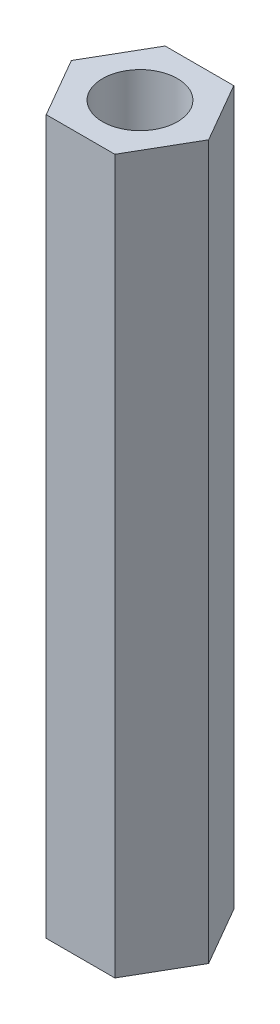
ISO-10303-21;
HEADER;
FILE_DESCRIPTION(('STEP AP214'),'2;1');
FILE_NAME('part.step','',(''),(''),'','','');
FILE_SCHEMA(('AUTOMOTIVE_DESIGN { 1 0 10303 214 1 1 1 1 }'));
ENDSEC;
DATA;
#1=APPLICATION_CONTEXT('core data for automotive mechanical design processes');
#2=APPLICATION_PROTOCOL_DEFINITION('international standard','automotive_design',2000,#1);
#3=PRODUCT_CONTEXT('',#1,'mechanical');
#4=PRODUCT('Part','Part','',(#3));
#5=PRODUCT_RELATED_PRODUCT_CATEGORY('part','',(#4));
#6=PRODUCT_DEFINITION_FORMATION('','',#4);
#7=PRODUCT_DEFINITION_CONTEXT('part definition',#1,'design');
#8=PRODUCT_DEFINITION('design','',#6,#7);
#9=PRODUCT_DEFINITION_SHAPE('','',#8);
#10=(LENGTH_UNIT() NAMED_UNIT(*) SI_UNIT(.MILLI.,.METRE.));
#11=(NAMED_UNIT(*) PLANE_ANGLE_UNIT() SI_UNIT($,.RADIAN.));
#12=(NAMED_UNIT(*) SI_UNIT($,.STERADIAN.) SOLID_ANGLE_UNIT());
#13=UNCERTAINTY_MEASURE_WITH_UNIT(LENGTH_MEASURE(1.E-05),#10,'distance_accuracy_value','');
#14=(GEOMETRIC_REPRESENTATION_CONTEXT(3) GLOBAL_UNCERTAINTY_ASSIGNED_CONTEXT((#13)) GLOBAL_UNIT_ASSIGNED_CONTEXT((#10,
#11,#12)) REPRESENTATION_CONTEXT('',''));
#15=CARTESIAN_POINT('',(0.,0.,0.));
#16=DIRECTION('',(0.,0.,1.));
#17=DIRECTION('',(1.,0.,0.));
#18=AXIS2_PLACEMENT_3D('',#15,#16,#17);
#19=CARTESIAN_POINT('',(1.44337567297409,30.,2.49999999999998));
#20=DIRECTION('',(-0.866025403784442,0.,-0.499999999999995));
#21=DIRECTION('',(-0.499999999999995,0.,0.866025403784442));
#22=AXIS2_PLACEMENT_3D('',#19,#20,#21);
#23=PLANE('',#22);
#24=DIRECTION('',(0.499999999999995,0.,-0.866025403784442));
#25=VECTOR('',#24,1.);
#26=CARTESIAN_POINT('',(1.44337567297409,0.,2.49999999999998));
#27=LINE('',#26,#25);
#28=CARTESIAN_POINT('',(1.44337567297409,0.,2.49999999999998));
#29=VERTEX_POINT('',#28);
#30=CARTESIAN_POINT('',(2.88675134594812,0.,0.));
#31=VERTEX_POINT('',#30);
#32=EDGE_CURVE('E124',#29,#31,#27,.T.);
#33=ORIENTED_EDGE('',*,*,#32,.T.);
#34=DIRECTION('',(0.,-1.,0.));
#35=VECTOR('',#34,1.);
#36=CARTESIAN_POINT('',(2.88675134594812,30.,0.));
#37=LINE('',#36,#35);
#38=CARTESIAN_POINT('',(2.88675134594812,30.,0.));
#39=VERTEX_POINT('',#38);
#40=EDGE_CURVE('E11',#39,#31,#37,.T.);
#41=ORIENTED_EDGE('',*,*,#40,.F.);
#42=DIRECTION('',(0.499999999999995,0.,-0.866025403784442));
#43=VECTOR('',#42,1.);
#44=CARTESIAN_POINT('',(1.44337567297409,30.,2.49999999999998));
#45=LINE('',#44,#43);
#46=CARTESIAN_POINT('',(1.44337567297409,30.,2.49999999999998));
#47=VERTEX_POINT('',#46);
#48=EDGE_CURVE('E135',#47,#39,#45,.T.);
#49=ORIENTED_EDGE('',*,*,#48,.F.);
#50=DIRECTION('',(0.,-1.,0.));
#51=VECTOR('',#50,1.);
#52=CARTESIAN_POINT('',(1.44337567297409,30.,2.49999999999998));
#53=LINE('',#52,#51);
#54=EDGE_CURVE('E120',#47,#29,#53,.T.);
#55=ORIENTED_EDGE('',*,*,#54,.T.);
#56=EDGE_LOOP('',(#33,#41,#49,#55));
#57=FACE_BOUND('',#56,.T.);
#58=ADVANCED_FACE('F37',(#57),#23,.F.);
#59=CARTESIAN_POINT('',(2.88675134594812,30.,0.));
#60=DIRECTION('',(-0.866025403784438,0.,0.500000000000001));
#61=DIRECTION('',(0.500000000000001,0.,0.866025403784438));
#62=AXIS2_PLACEMENT_3D('',#59,#60,#61);
#63=PLANE('',#62);
#64=DIRECTION('',(-0.500000000000001,0.,-0.866025403784438));
#65=VECTOR('',#64,1.);
#66=CARTESIAN_POINT('',(2.88675134594812,0.,0.));
#67=LINE('',#66,#65);
#68=CARTESIAN_POINT('',(1.44337567297405,0.,-2.5));
#69=VERTEX_POINT('',#68);
#70=EDGE_CURVE('E127',#31,#69,#67,.T.);
#71=ORIENTED_EDGE('',*,*,#70,.T.);
#72=DIRECTION('',(0.,-1.,0.));
#73=VECTOR('',#72,1.);
#74=CARTESIAN_POINT('',(1.44337567297405,30.,-2.5));
#75=LINE('',#74,#73);
#76=CARTESIAN_POINT('',(1.44337567297405,30.,-2.5));
#77=VERTEX_POINT('',#76);
#78=EDGE_CURVE('E45',#77,#69,#75,.T.);
#79=ORIENTED_EDGE('',*,*,#78,.F.);
#80=DIRECTION('',(-0.500000000000001,0.,-0.866025403784438));
#81=VECTOR('',#80,1.);
#82=CARTESIAN_POINT('',(2.88675134594812,30.,0.));
#83=LINE('',#82,#81);
#84=EDGE_CURVE('E91',#39,#77,#83,.T.);
#85=ORIENTED_EDGE('',*,*,#84,.F.);
#86=ORIENTED_EDGE('',*,*,#40,.T.);
#87=EDGE_LOOP('',(#71,#79,#85,#86));
#88=FACE_BOUND('',#87,.T.);
#89=ADVANCED_FACE('F160',(#88),#63,.F.);
#90=CARTESIAN_POINT('',(1.44337567297405,30.,-2.5));
#91=DIRECTION('',(0.,0.,1.));
#92=DIRECTION('',(1.,0.,0.));
#93=AXIS2_PLACEMENT_3D('',#90,#91,#92);
#94=PLANE('',#93);
#95=DIRECTION('',(-1.,0.,0.));
#96=VECTOR('',#95,1.);
#97=CARTESIAN_POINT('',(1.44337567297405,0.,-2.5));
#98=LINE('',#97,#96);
#99=CARTESIAN_POINT('',(-1.44337567297407,0.,-2.49999999999999));
#100=VERTEX_POINT('',#99);
#101=EDGE_CURVE('E130',#69,#100,#98,.T.);
#102=ORIENTED_EDGE('',*,*,#101,.T.);
#103=DIRECTION('',(0.,-1.,0.));
#104=VECTOR('',#103,1.);
#105=CARTESIAN_POINT('',(-1.44337567297407,30.,-2.49999999999999));
#106=LINE('',#105,#104);
#107=CARTESIAN_POINT('',(-1.44337567297407,30.,-2.49999999999999));
#108=VERTEX_POINT('',#107);
#109=EDGE_CURVE('E115',#108,#100,#106,.T.);
#110=ORIENTED_EDGE('',*,*,#109,.F.);
#111=DIRECTION('',(-1.,0.,0.));
#112=VECTOR('',#111,1.);
#113=CARTESIAN_POINT('',(1.44337567297405,30.,-2.5));
#114=LINE('',#113,#112);
#115=EDGE_CURVE('E106',#77,#108,#114,.T.);
#116=ORIENTED_EDGE('',*,*,#115,.F.);
#117=ORIENTED_EDGE('',*,*,#78,.T.);
#118=EDGE_LOOP('',(#102,#110,#116,#117));
#119=FACE_BOUND('',#118,.T.);
#120=ADVANCED_FACE('F141',(#119),#94,.F.);
#121=CARTESIAN_POINT('',(-1.44337567297407,30.,-2.49999999999999));
#122=DIRECTION('',(0.866025403784442,0.,0.499999999999995));
#123=DIRECTION('',(0.499999999999995,0.,-0.866025403784442));
#124=AXIS2_PLACEMENT_3D('',#121,#122,#123);
#125=PLANE('',#124);
#126=DIRECTION('',(-0.499999999999995,0.,0.866025403784442));
#127=VECTOR('',#126,1.);
#128=CARTESIAN_POINT('',(-1.44337567297407,0.,-2.49999999999999));
#129=LINE('',#128,#127);
#130=CARTESIAN_POINT('',(-2.88675134594812,0.,0.));
#131=VERTEX_POINT('',#130);
#132=EDGE_CURVE('E114',#100,#131,#129,.T.);
#133=ORIENTED_EDGE('',*,*,#132,.T.);
#134=DIRECTION('',(0.,-1.,0.));
#135=VECTOR('',#134,1.);
#136=CARTESIAN_POINT('',(-2.88675134594812,30.,0.));
#137=LINE('',#136,#135);
#138=CARTESIAN_POINT('',(-2.88675134594812,30.,0.));
#139=VERTEX_POINT('',#138);
#140=EDGE_CURVE('E111',#139,#131,#137,.T.);
#141=ORIENTED_EDGE('',*,*,#140,.F.);
#142=DIRECTION('',(-0.499999999999995,0.,0.866025403784442));
#143=VECTOR('',#142,1.);
#144=CARTESIAN_POINT('',(-1.44337567297407,30.,-2.49999999999999));
#145=LINE('',#144,#143);
#146=EDGE_CURVE('E100',#108,#139,#145,.T.);
#147=ORIENTED_EDGE('',*,*,#146,.F.);
#148=ORIENTED_EDGE('',*,*,#109,.T.);
#149=EDGE_LOOP('',(#133,#141,#147,#148));
#150=FACE_BOUND('',#149,.T.);
#151=ADVANCED_FACE('F112',(#150),#125,.F.);
#152=CARTESIAN_POINT('',(-2.88675134594812,30.,0.));
#153=DIRECTION('',(0.866025403784435,0.,-0.500000000000007));
#154=DIRECTION('',(-0.500000000000007,0.,-0.866025403784435));
#155=AXIS2_PLACEMENT_3D('',#152,#153,#154);
#156=PLANE('',#155);
#157=DIRECTION('',(0.500000000000007,0.,0.866025403784435));
#158=VECTOR('',#157,1.);
#159=CARTESIAN_POINT('',(-2.88675134594812,0.,0.));
#160=LINE('',#159,#158);
#161=CARTESIAN_POINT('',(-1.44337567297404,0.,2.50000000000001));
#162=VERTEX_POINT('',#161);
#163=EDGE_CURVE('E77',#131,#162,#160,.T.);
#164=ORIENTED_EDGE('',*,*,#163,.T.);
#165=DIRECTION('',(0.,-1.,0.));
#166=VECTOR('',#165,1.);
#167=CARTESIAN_POINT('',(-1.44337567297404,30.,2.50000000000001));
#168=LINE('',#167,#166);
#169=CARTESIAN_POINT('',(-1.44337567297404,30.,2.50000000000001));
#170=VERTEX_POINT('',#169);
#171=EDGE_CURVE('E116',#170,#162,#168,.T.);
#172=ORIENTED_EDGE('',*,*,#171,.F.);
#173=DIRECTION('',(0.500000000000007,0.,0.866025403784435));
#174=VECTOR('',#173,1.);
#175=CARTESIAN_POINT('',(-2.88675134594812,30.,0.));
#176=LINE('',#175,#174);
#177=EDGE_CURVE('E104',#139,#170,#176,.T.);
#178=ORIENTED_EDGE('',*,*,#177,.F.);
#179=ORIENTED_EDGE('',*,*,#140,.T.);
#180=EDGE_LOOP('',(#164,#172,#178,#179));
#181=FACE_BOUND('',#180,.T.);
#182=ADVANCED_FACE('F118',(#181),#156,.F.);
#183=CARTESIAN_POINT('',(-1.44337567297404,30.,2.50000000000001));
#184=DIRECTION('',(0.,0.,-1.));
#185=DIRECTION('',(-1.,0.,0.));
#186=AXIS2_PLACEMENT_3D('',#183,#184,#185);
#187=PLANE('',#186);
#188=DIRECTION('',(1.,0.,0.));
#189=VECTOR('',#188,1.);
#190=CARTESIAN_POINT('',(-1.44337567297404,0.,2.50000000000001));
#191=LINE('',#190,#189);
#192=EDGE_CURVE('E83',#162,#29,#191,.T.);
#193=ORIENTED_EDGE('',*,*,#192,.T.);
#194=ORIENTED_EDGE('',*,*,#54,.F.);
#195=DIRECTION('',(1.,0.,0.));
#196=VECTOR('',#195,1.);
#197=CARTESIAN_POINT('',(-1.44337567297404,30.,2.50000000000001));
#198=LINE('',#197,#196);
#199=EDGE_CURVE('E53',#170,#47,#198,.T.);
#200=ORIENTED_EDGE('',*,*,#199,.F.);
#201=ORIENTED_EDGE('',*,*,#171,.T.);
#202=EDGE_LOOP('',(#193,#194,#200,#201));
#203=FACE_BOUND('',#202,.T.);
#204=ADVANCED_FACE('F148',(#203),#187,.F.);
#205=CARTESIAN_POINT('',(0.,30.,0.));
#206=DIRECTION('',(0.,1.,0.));
#207=DIRECTION('',(0.,0.,1.));
#208=AXIS2_PLACEMENT_3D('',#205,#206,#207);
#209=PLANE('',#208);
#210=CARTESIAN_POINT('',(0.,30.,0.));
#211=DIRECTION('',(0.,1.,0.));
#212=DIRECTION('',(0.,0.,1.));
#213=AXIS2_PLACEMENT_3D('',#210,#211,#212);
#214=CIRCLE('',#213,1.57499999999999);
#215=CARTESIAN_POINT('',(0.,30.,1.57499999999999));
#216=VERTEX_POINT('',#215);
#217=EDGE_CURVE('E248',#216,#216,#214,.T.);
#218=ORIENTED_EDGE('',*,*,#217,.F.);
#219=EDGE_LOOP('',(#218));
#220=FACE_BOUND('',#219,.T.);
#221=ORIENTED_EDGE('',*,*,#48,.T.);
#222=ORIENTED_EDGE('',*,*,#84,.T.);
#223=ORIENTED_EDGE('',*,*,#115,.T.);
#224=ORIENTED_EDGE('',*,*,#146,.T.);
#225=ORIENTED_EDGE('',*,*,#177,.T.);
#226=ORIENTED_EDGE('',*,*,#199,.T.);
#227=EDGE_LOOP('',(#221,#222,#223,#224,#225,#226));
#228=FACE_BOUND('',#227,.T.);
#229=ADVANCED_FACE('F102',(#220,#228),#209,.T.);
#230=CARTESIAN_POINT('',(0.,0.,0.));
#231=DIRECTION('',(0.,1.,0.));
#232=DIRECTION('',(0.,0.,1.));
#233=AXIS2_PLACEMENT_3D('',#230,#231,#232);
#234=PLANE('',#233);
#235=CARTESIAN_POINT('',(0.,0.,0.));
#236=DIRECTION('',(0.,-1.,0.));
#237=DIRECTION('',(0.,0.,-1.));
#238=AXIS2_PLACEMENT_3D('',#235,#236,#237);
#239=CIRCLE('',#238,1.57499999999999);
#240=CARTESIAN_POINT('',(0.,0.,-1.57499999999999));
#241=VERTEX_POINT('',#240);
#242=EDGE_CURVE('E246',#241,#241,#239,.T.);
#243=ORIENTED_EDGE('',*,*,#242,.F.);
#244=EDGE_LOOP('',(#243));
#245=FACE_BOUND('',#244,.T.);
#246=ORIENTED_EDGE('',*,*,#32,.F.);
#247=ORIENTED_EDGE('',*,*,#192,.F.);
#248=ORIENTED_EDGE('',*,*,#163,.F.);
#249=ORIENTED_EDGE('',*,*,#132,.F.);
#250=ORIENTED_EDGE('',*,*,#101,.F.);
#251=ORIENTED_EDGE('',*,*,#70,.F.);
#252=EDGE_LOOP('',(#246,#247,#248,#249,#250,#251));
#253=FACE_BOUND('',#252,.T.);
#254=ADVANCED_FACE('F144',(#245,#253),#234,.F.);
#255=CARTESIAN_POINT('',(0.,22.,0.));
#256=DIRECTION('',(0.,1.,0.));
#257=DIRECTION('',(0.,0.,1.));
#258=AXIS2_PLACEMENT_3D('',#255,#256,#257);
#259=CONICAL_SURFACE('',#258,1.57499999999999,1.02974425867665);
#260=CARTESIAN_POINT('',(0.,21.0536445250316,0.));
#261=VERTEX_POINT('',#260);
#262=VERTEX_LOOP('',#261);
#263=FACE_BOUND('',#262,.T.);
#264=CARTESIAN_POINT('',(0.,22.,0.));
#265=DIRECTION('',(0.,1.,0.));
#266=DIRECTION('',(0.,0.,1.));
#267=AXIS2_PLACEMENT_3D('',#264,#265,#266);
#268=CIRCLE('',#267,1.57499999999999);
#269=CARTESIAN_POINT('',(0.,22.,1.57499999999999));
#270=VERTEX_POINT('',#269);
#271=EDGE_CURVE('E128',#270,#270,#268,.T.);
#272=ORIENTED_EDGE('',*,*,#271,.T.);
#273=EDGE_LOOP('',(#272));
#274=FACE_BOUND('',#273,.T.);
#275=ADVANCED_FACE('F195',(#263,#274),#259,.F.);
#276=CARTESIAN_POINT('',(0.,30.,0.));
#277=DIRECTION('',(0.,1.,0.));
#278=DIRECTION('',(0.,0.,1.));
#279=AXIS2_PLACEMENT_3D('',#276,#277,#278);
#280=CYLINDRICAL_SURFACE('',#279,1.57499999999999);
#281=ORIENTED_EDGE('',*,*,#271,.F.);
#282=EDGE_LOOP('',(#281));
#283=FACE_BOUND('',#282,.T.);
#284=ORIENTED_EDGE('',*,*,#217,.T.);
#285=EDGE_LOOP('',(#284));
#286=FACE_BOUND('',#285,.T.);
#287=ADVANCED_FACE('F200',(#283,#286),#280,.F.);
#288=CARTESIAN_POINT('',(0.,7.99999999999999,0.));
#289=DIRECTION('',(0.,-1.,0.));
#290=DIRECTION('',(0.,0.,-1.));
#291=AXIS2_PLACEMENT_3D('',#288,#289,#290);
#292=CONICAL_SURFACE('',#291,1.57499999999999,1.02974425867665);
#293=CARTESIAN_POINT('',(0.,8.94635547496841,0.));
#294=VERTEX_POINT('',#293);
#295=VERTEX_LOOP('',#294);
#296=FACE_BOUND('',#295,.T.);
#297=CARTESIAN_POINT('',(0.,7.99999999999999,0.));
#298=DIRECTION('',(0.,-1.,0.));
#299=DIRECTION('',(0.,0.,-1.));
#300=AXIS2_PLACEMENT_3D('',#297,#298,#299);
#301=CIRCLE('',#300,1.57499999999999);
#302=CARTESIAN_POINT('',(0.,7.99999999999999,-1.57499999999999));
#303=VERTEX_POINT('',#302);
#304=EDGE_CURVE('E243',#303,#303,#301,.T.);
#305=ORIENTED_EDGE('',*,*,#304,.T.);
#306=EDGE_LOOP('',(#305));
#307=FACE_BOUND('',#306,.T.);
#308=ADVANCED_FACE('F210',(#296,#307),#292,.F.);
#309=CARTESIAN_POINT('',(0.,0.,0.));
#310=DIRECTION('',(0.,-1.,0.));
#311=DIRECTION('',(0.,0.,-1.));
#312=AXIS2_PLACEMENT_3D('',#309,#310,#311);
#313=CYLINDRICAL_SURFACE('',#312,1.57499999999999);
#314=ORIENTED_EDGE('',*,*,#304,.F.);
#315=EDGE_LOOP('',(#314));
#316=FACE_BOUND('',#315,.T.);
#317=ORIENTED_EDGE('',*,*,#242,.T.);
#318=EDGE_LOOP('',(#317));
#319=FACE_BOUND('',#318,.T.);
#320=ADVANCED_FACE('F226',(#316,#319),#313,.F.);
#321=CLOSED_SHELL('',(#58,#89,#120,#151,#182,#204,#229,#254,#275,#287,#308,#320));
#322=MANIFOLD_SOLID_BREP('B2',#321);
#323=ADVANCED_BREP_SHAPE_REPRESENTATION('',(#18,#322),#14);
#324=SHAPE_DEFINITION_REPRESENTATION(#9,#323);
ENDSEC;
END-ISO-10303-21;
